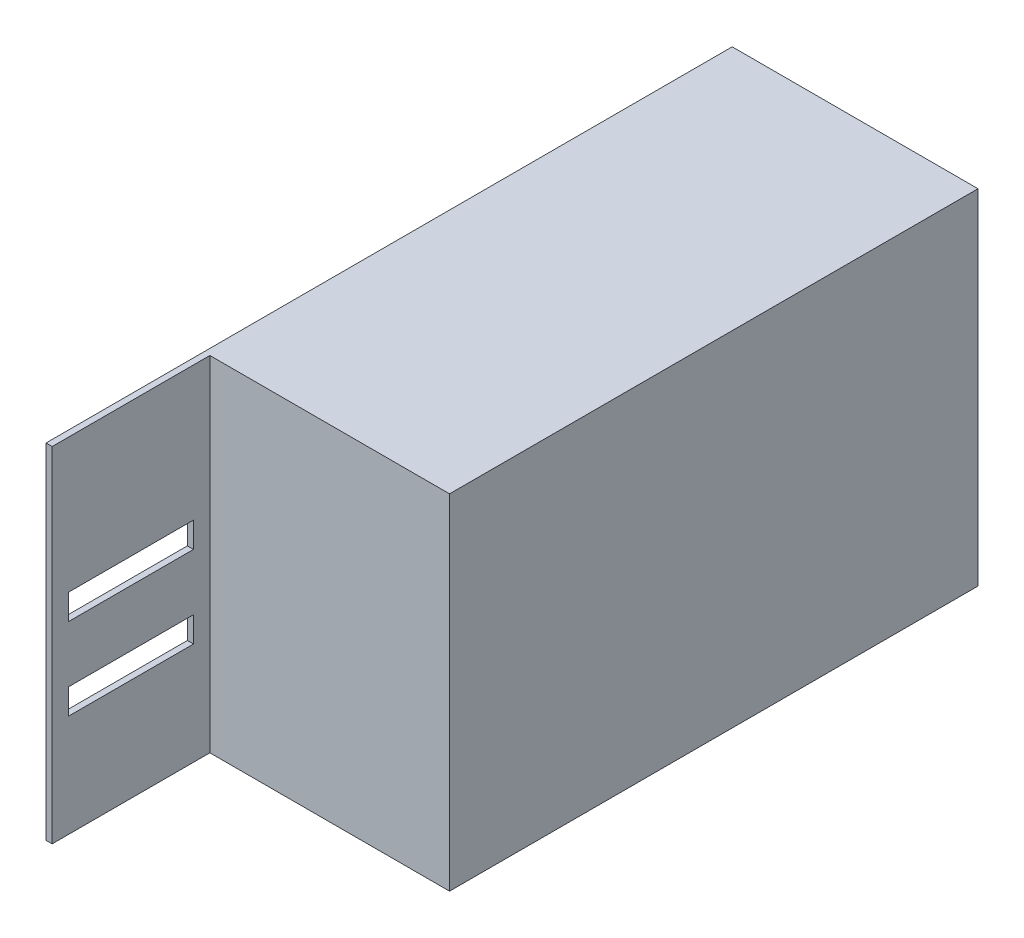
ISO-10303-21;
HEADER;
FILE_DESCRIPTION(('STEP AP214'),'2;1');
FILE_NAME('part.step','',(''),(''),'','','');
FILE_SCHEMA(('AUTOMOTIVE_DESIGN { 1 0 10303 214 1 1 1 1 }'));
ENDSEC;
DATA;
#1=APPLICATION_CONTEXT('core data for automotive mechanical design processes');
#2=APPLICATION_PROTOCOL_DEFINITION('international standard','automotive_design',2000,#1);
#3=PRODUCT_CONTEXT('',#1,'mechanical');
#4=PRODUCT('Part','Part','',(#3));
#5=PRODUCT_RELATED_PRODUCT_CATEGORY('part','',(#4));
#6=PRODUCT_DEFINITION_FORMATION('','',#4);
#7=PRODUCT_DEFINITION_CONTEXT('part definition',#1,'design');
#8=PRODUCT_DEFINITION('design','',#6,#7);
#9=PRODUCT_DEFINITION_SHAPE('','',#8);
#10=(LENGTH_UNIT() NAMED_UNIT(*) SI_UNIT(.MILLI.,.METRE.));
#11=(NAMED_UNIT(*) PLANE_ANGLE_UNIT() SI_UNIT($,.RADIAN.));
#12=(NAMED_UNIT(*) SI_UNIT($,.STERADIAN.) SOLID_ANGLE_UNIT());
#13=UNCERTAINTY_MEASURE_WITH_UNIT(LENGTH_MEASURE(1.E-05),#10,'distance_accuracy_value','');
#14=(GEOMETRIC_REPRESENTATION_CONTEXT(3) GLOBAL_UNCERTAINTY_ASSIGNED_CONTEXT((#13)) GLOBAL_UNIT_ASSIGNED_CONTEXT((#10,
#11,#12)) REPRESENTATION_CONTEXT('',''));
#15=CARTESIAN_POINT('',(0.,0.,0.));
#16=DIRECTION('',(0.,0.,1.));
#17=DIRECTION('',(1.,0.,0.));
#18=AXIS2_PLACEMENT_3D('',#15,#16,#17);
#19=CARTESIAN_POINT('',(60.,0.,0.));
#20=DIRECTION('',(0.,0.,-1.));
#21=DIRECTION('',(-1.,0.,0.));
#22=AXIS2_PLACEMENT_3D('',#19,#20,#21);
#23=PLANE('',#22);
#24=DIRECTION('',(0.,1.,0.));
#25=VECTOR('',#24,1.);
#26=CARTESIAN_POINT('',(1.5,0.,0.));
#27=LINE('',#26,#25);
#28=CARTESIAN_POINT('',(1.5,0.,0.));
#29=VERTEX_POINT('',#28);
#30=CARTESIAN_POINT('',(1.5,84.,0.));
#31=VERTEX_POINT('',#30);
#32=EDGE_CURVE('E285',#29,#31,#27,.T.);
#33=ORIENTED_EDGE('',*,*,#32,.F.);
#34=DIRECTION('',(-1.,0.,0.));
#35=VECTOR('',#34,1.);
#36=CARTESIAN_POINT('',(60.,0.,0.));
#37=LINE('',#36,#35);
#38=CARTESIAN_POINT('',(60.,0.,0.));
#39=VERTEX_POINT('',#38);
#40=EDGE_CURVE('E345',#39,#29,#37,.T.);
#41=ORIENTED_EDGE('',*,*,#40,.F.);
#42=DIRECTION('',(0.,-1.,0.));
#43=VECTOR('',#42,1.);
#44=CARTESIAN_POINT('',(60.,0.,0.));
#45=LINE('',#44,#43);
#46=CARTESIAN_POINT('',(60.,84.,0.));
#47=VERTEX_POINT('',#46);
#48=EDGE_CURVE('E342',#47,#39,#45,.T.);
#49=ORIENTED_EDGE('',*,*,#48,.F.);
#50=DIRECTION('',(-1.,0.,0.));
#51=VECTOR('',#50,1.);
#52=CARTESIAN_POINT('',(60.,84.,0.));
#53=LINE('',#52,#51);
#54=EDGE_CURVE('E358',#47,#31,#53,.T.);
#55=ORIENTED_EDGE('',*,*,#54,.T.);
#56=EDGE_LOOP('',(#33,#41,#49,#55));
#57=FACE_BOUND('',#56,.T.);
#58=ADVANCED_FACE('F45',(#57),#23,.F.);
#59=CARTESIAN_POINT('',(60.,0.,-129.));
#60=DIRECTION('',(0.,0.,1.));
#61=DIRECTION('',(1.,0.,0.));
#62=AXIS2_PLACEMENT_3D('',#59,#60,#61);
#63=PLANE('',#62);
#64=DIRECTION('',(1.,0.,0.));
#65=VECTOR('',#64,1.);
#66=CARTESIAN_POINT('',(1.5,1.5,-129.));
#67=LINE('',#66,#65);
#68=CARTESIAN_POINT('',(0.,1.5,-129.));
#69=VERTEX_POINT('',#68);
#70=CARTESIAN_POINT('',(58.5,1.5,-129.));
#71=VERTEX_POINT('',#70);
#72=EDGE_CURVE('E300',#69,#71,#67,.T.);
#73=ORIENTED_EDGE('',*,*,#72,.T.);
#74=DIRECTION('',(0.,1.,0.));
#75=VECTOR('',#74,1.);
#76=CARTESIAN_POINT('',(58.5,1.5,-129.));
#77=LINE('',#76,#75);
#78=CARTESIAN_POINT('',(58.5,82.5,-129.));
#79=VERTEX_POINT('',#78);
#80=EDGE_CURVE('E296',#71,#79,#77,.T.);
#81=ORIENTED_EDGE('',*,*,#80,.T.);
#82=DIRECTION('',(1.,0.,0.));
#83=VECTOR('',#82,1.);
#84=CARTESIAN_POINT('',(1.5,82.5,-129.));
#85=LINE('',#84,#83);
#86=CARTESIAN_POINT('',(0.,82.5,-129.));
#87=VERTEX_POINT('',#86);
#88=EDGE_CURVE('E292',#87,#79,#85,.T.);
#89=ORIENTED_EDGE('',*,*,#88,.F.);
#90=DIRECTION('',(0.,1.,0.));
#91=VECTOR('',#90,1.);
#92=CARTESIAN_POINT('',(0.,0.,-129.));
#93=LINE('',#92,#91);
#94=CARTESIAN_POINT('',(0.,84.,-129.));
#95=VERTEX_POINT('',#94);
#96=EDGE_CURVE('E348',#87,#95,#93,.T.);
#97=ORIENTED_EDGE('',*,*,#96,.T.);
#98=DIRECTION('',(-1.,0.,0.));
#99=VECTOR('',#98,1.);
#100=CARTESIAN_POINT('',(60.,84.,-129.));
#101=LINE('',#100,#99);
#102=CARTESIAN_POINT('',(60.,84.,-129.));
#103=VERTEX_POINT('',#102);
#104=EDGE_CURVE('E54',#103,#95,#101,.T.);
#105=ORIENTED_EDGE('',*,*,#104,.F.);
#106=DIRECTION('',(0.,1.,0.));
#107=VECTOR('',#106,1.);
#108=CARTESIAN_POINT('',(60.,0.,-129.));
#109=LINE('',#108,#107);
#110=CARTESIAN_POINT('',(60.,0.,-129.));
#111=VERTEX_POINT('',#110);
#112=EDGE_CURVE('E335',#111,#103,#109,.T.);
#113=ORIENTED_EDGE('',*,*,#112,.F.);
#114=DIRECTION('',(-1.,0.,0.));
#115=VECTOR('',#114,1.);
#116=CARTESIAN_POINT('',(60.,0.,-129.));
#117=LINE('',#116,#115);
#118=CARTESIAN_POINT('',(0.,0.,-129.));
#119=VERTEX_POINT('',#118);
#120=EDGE_CURVE('E11',#111,#119,#117,.T.);
#121=ORIENTED_EDGE('',*,*,#120,.T.);
#122=EDGE_CURVE('E349',#119,#69,#93,.T.);
#123=ORIENTED_EDGE('',*,*,#122,.T.);
#124=EDGE_LOOP('',(#73,#81,#89,#97,#105,#113,#121,#123));
#125=FACE_BOUND('',#124,.T.);
#126=ADVANCED_FACE('F389',(#125),#63,.F.);
#127=CARTESIAN_POINT('',(0.,0.,0.));
#128=DIRECTION('',(1.,0.,0.));
#129=DIRECTION('',(0.,0.,-1.));
#130=AXIS2_PLACEMENT_3D('',#127,#128,#129);
#131=PLANE('',#130);
#132=DIRECTION('',(0.,0.,1.));
#133=VECTOR('',#132,1.);
#134=CARTESIAN_POINT('',(0.,31.2,34.5));
#135=LINE('',#134,#133);
#136=CARTESIAN_POINT('',(0.,31.2,4.));
#137=VERTEX_POINT('',#136);
#138=CARTESIAN_POINT('',(0.,31.2,34.5));
#139=VERTEX_POINT('',#138);
#140=EDGE_CURVE('E184',#137,#139,#135,.T.);
#141=ORIENTED_EDGE('',*,*,#140,.T.);
#142=DIRECTION('',(0.,-1.,0.));
#143=VECTOR('',#142,1.);
#144=CARTESIAN_POINT('',(0.,25.,34.5));
#145=LINE('',#144,#143);
#146=CARTESIAN_POINT('',(0.,25.,34.5));
#147=VERTEX_POINT('',#146);
#148=EDGE_CURVE('E175',#139,#147,#145,.T.);
#149=ORIENTED_EDGE('',*,*,#148,.T.);
#150=DIRECTION('',(0.,0.,-1.));
#151=VECTOR('',#150,1.);
#152=CARTESIAN_POINT('',(0.,25.,34.5));
#153=LINE('',#152,#151);
#154=CARTESIAN_POINT('',(0.,25.,4.));
#155=VERTEX_POINT('',#154);
#156=EDGE_CURVE('E187',#147,#155,#153,.T.);
#157=ORIENTED_EDGE('',*,*,#156,.T.);
#158=DIRECTION('',(0.,1.,0.));
#159=VECTOR('',#158,1.);
#160=CARTESIAN_POINT('',(0.,25.,4.));
#161=LINE('',#160,#159);
#162=EDGE_CURVE('E61',#155,#137,#161,.T.);
#163=ORIENTED_EDGE('',*,*,#162,.T.);
#164=EDGE_LOOP('',(#141,#149,#157,#163));
#165=FACE_BOUND('',#164,.T.);
#166=DIRECTION('',(0.,0.,1.));
#167=VECTOR('',#166,1.);
#168=CARTESIAN_POINT('',(0.,51.2,34.5));
#169=LINE('',#168,#167);
#170=CARTESIAN_POINT('',(0.,51.2,4.));
#171=VERTEX_POINT('',#170);
#172=CARTESIAN_POINT('',(0.,51.2,34.5));
#173=VERTEX_POINT('',#172);
#174=EDGE_CURVE('E229',#171,#173,#169,.T.);
#175=ORIENTED_EDGE('',*,*,#174,.T.);
#176=DIRECTION('',(0.,-1.,0.));
#177=VECTOR('',#176,1.);
#178=CARTESIAN_POINT('',(0.,45.,34.5));
#179=LINE('',#178,#177);
#180=CARTESIAN_POINT('',(0.,45.,34.5));
#181=VERTEX_POINT('',#180);
#182=EDGE_CURVE('E244',#173,#181,#179,.T.);
#183=ORIENTED_EDGE('',*,*,#182,.T.);
#184=DIRECTION('',(0.,0.,-1.));
#185=VECTOR('',#184,1.);
#186=CARTESIAN_POINT('',(0.,45.,34.5));
#187=LINE('',#186,#185);
#188=CARTESIAN_POINT('',(0.,45.,4.));
#189=VERTEX_POINT('',#188);
#190=EDGE_CURVE('E259',#181,#189,#187,.T.);
#191=ORIENTED_EDGE('',*,*,#190,.T.);
#192=DIRECTION('',(0.,1.,0.));
#193=VECTOR('',#192,1.);
#194=CARTESIAN_POINT('',(0.,45.,4.));
#195=LINE('',#194,#193);
#196=EDGE_CURVE('E69',#189,#171,#195,.T.);
#197=ORIENTED_EDGE('',*,*,#196,.T.);
#198=EDGE_LOOP('',(#175,#183,#191,#197));
#199=FACE_BOUND('',#198,.T.);
#200=DIRECTION('',(0.,0.,1.));
#201=VECTOR('',#200,1.);
#202=CARTESIAN_POINT('',(0.,82.5,0.));
#203=LINE('',#202,#201);
#204=CARTESIAN_POINT('',(0.,82.5,-1.5));
#205=VERTEX_POINT('',#204);
#206=EDGE_CURVE('E324',#87,#205,#203,.T.);
#207=ORIENTED_EDGE('',*,*,#206,.T.);
#208=DIRECTION('',(0.,-1.,0.));
#209=VECTOR('',#208,1.);
#210=CARTESIAN_POINT('',(0.,0.,-1.5));
#211=LINE('',#210,#209);
#212=CARTESIAN_POINT('',(0.,1.5,-1.5));
#213=VERTEX_POINT('',#212);
#214=EDGE_CURVE('E309',#205,#213,#211,.T.);
#215=ORIENTED_EDGE('',*,*,#214,.T.);
#216=DIRECTION('',(0.,0.,-1.));
#217=VECTOR('',#216,1.);
#218=CARTESIAN_POINT('',(0.,1.5,0.));
#219=LINE('',#218,#217);
#220=EDGE_CURVE('E304',#213,#69,#219,.T.);
#221=ORIENTED_EDGE('',*,*,#220,.T.);
#222=ORIENTED_EDGE('',*,*,#122,.F.);
#223=DIRECTION('',(0.,0.,-1.));
#224=VECTOR('',#223,1.);
#225=CARTESIAN_POINT('',(0.,0.,0.));
#226=LINE('',#225,#224);
#227=CARTESIAN_POINT('',(0.,0.,38.5));
#228=VERTEX_POINT('',#227);
#229=EDGE_CURVE('E317',#228,#119,#226,.T.);
#230=ORIENTED_EDGE('',*,*,#229,.F.);
#231=DIRECTION('',(0.,1.,0.));
#232=VECTOR('',#231,1.);
#233=CARTESIAN_POINT('',(0.,84.,38.5));
#234=LINE('',#233,#232);
#235=CARTESIAN_POINT('',(0.,84.,38.5));
#236=VERTEX_POINT('',#235);
#237=EDGE_CURVE('E219',#228,#236,#234,.T.);
#238=ORIENTED_EDGE('',*,*,#237,.T.);
#239=DIRECTION('',(0.,0.,1.));
#240=VECTOR('',#239,1.);
#241=CARTESIAN_POINT('',(0.,84.,0.));
#242=LINE('',#241,#240);
#243=EDGE_CURVE('E336',#95,#236,#242,.T.);
#244=ORIENTED_EDGE('',*,*,#243,.F.);
#245=ORIENTED_EDGE('',*,*,#96,.F.);
#246=EDGE_LOOP('',(#207,#215,#221,#222,#230,#238,#244,#245));
#247=FACE_BOUND('',#246,.T.);
#248=ADVANCED_FACE('F192',(#165,#199,#247),#131,.F.);
#249=CARTESIAN_POINT('',(60.,0.,0.));
#250=DIRECTION('',(0.,1.,0.));
#251=DIRECTION('',(0.,0.,1.));
#252=AXIS2_PLACEMENT_3D('',#249,#250,#251);
#253=PLANE('',#252);
#254=ORIENTED_EDGE('',*,*,#229,.T.);
#255=ORIENTED_EDGE('',*,*,#120,.F.);
#256=DIRECTION('',(0.,0.,-1.));
#257=VECTOR('',#256,1.);
#258=CARTESIAN_POINT('',(60.,0.,0.));
#259=LINE('',#258,#257);
#260=EDGE_CURVE('E331',#39,#111,#259,.T.);
#261=ORIENTED_EDGE('',*,*,#260,.F.);
#262=ORIENTED_EDGE('',*,*,#40,.T.);
#263=DIRECTION('',(0.,0.,1.));
#264=VECTOR('',#263,1.);
#265=CARTESIAN_POINT('',(1.5,0.,-1.49999999999999));
#266=LINE('',#265,#264);
#267=CARTESIAN_POINT('',(1.5,0.,38.5));
#268=VERTEX_POINT('',#267);
#269=EDGE_CURVE('E266',#29,#268,#266,.T.);
#270=ORIENTED_EDGE('',*,*,#269,.T.);
#271=DIRECTION('',(-1.,0.,0.));
#272=VECTOR('',#271,1.);
#273=CARTESIAN_POINT('',(1.5,0.,38.5));
#274=LINE('',#273,#272);
#275=EDGE_CURVE('E277',#268,#228,#274,.T.);
#276=ORIENTED_EDGE('',*,*,#275,.T.);
#277=EDGE_LOOP('',(#254,#255,#261,#262,#270,#276));
#278=FACE_BOUND('',#277,.T.);
#279=ADVANCED_FACE('F47',(#278),#253,.F.);
#280=CARTESIAN_POINT('',(60.,84.,0.));
#281=DIRECTION('',(0.,-1.,0.));
#282=DIRECTION('',(0.,0.,-1.));
#283=AXIS2_PLACEMENT_3D('',#280,#281,#282);
#284=PLANE('',#283);
#285=ORIENTED_EDGE('',*,*,#243,.T.);
#286=DIRECTION('',(-1.,0.,0.));
#287=VECTOR('',#286,1.);
#288=CARTESIAN_POINT('',(1.5,84.,38.5));
#289=LINE('',#288,#287);
#290=CARTESIAN_POINT('',(1.5,84.,38.5));
#291=VERTEX_POINT('',#290);
#292=EDGE_CURVE('E281',#291,#236,#289,.T.);
#293=ORIENTED_EDGE('',*,*,#292,.F.);
#294=DIRECTION('',(0.,0.,-1.));
#295=VECTOR('',#294,1.);
#296=CARTESIAN_POINT('',(1.5,84.,-1.5));
#297=LINE('',#296,#295);
#298=EDGE_CURVE('E273',#291,#31,#297,.T.);
#299=ORIENTED_EDGE('',*,*,#298,.T.);
#300=ORIENTED_EDGE('',*,*,#54,.F.);
#301=DIRECTION('',(0.,0.,1.));
#302=VECTOR('',#301,1.);
#303=CARTESIAN_POINT('',(60.,84.,0.));
#304=LINE('',#303,#302);
#305=EDGE_CURVE('E339',#103,#47,#304,.T.);
#306=ORIENTED_EDGE('',*,*,#305,.F.);
#307=ORIENTED_EDGE('',*,*,#104,.T.);
#308=EDGE_LOOP('',(#285,#293,#299,#300,#306,#307));
#309=FACE_BOUND('',#308,.T.);
#310=ADVANCED_FACE('F366',(#309),#284,.F.);
#311=CARTESIAN_POINT('',(60.,0.,0.));
#312=DIRECTION('',(1.,0.,0.));
#313=DIRECTION('',(0.,0.,-1.));
#314=AXIS2_PLACEMENT_3D('',#311,#312,#313);
#315=PLANE('',#314);
#316=ORIENTED_EDGE('',*,*,#260,.T.);
#317=ORIENTED_EDGE('',*,*,#112,.T.);
#318=ORIENTED_EDGE('',*,*,#305,.T.);
#319=ORIENTED_EDGE('',*,*,#48,.T.);
#320=EDGE_LOOP('',(#316,#317,#318,#319));
#321=FACE_BOUND('',#320,.T.);
#322=ADVANCED_FACE('F388',(#321),#315,.T.);
#323=CARTESIAN_POINT('',(60.,1.5,0.));
#324=DIRECTION('',(0.,1.,0.));
#325=DIRECTION('',(0.,0.,1.));
#326=AXIS2_PLACEMENT_3D('',#323,#324,#325);
#327=PLANE('',#326);
#328=ORIENTED_EDGE('',*,*,#220,.F.);
#329=DIRECTION('',(-1.,0.,0.));
#330=VECTOR('',#329,1.);
#331=CARTESIAN_POINT('',(60.,1.5,-1.5));
#332=LINE('',#331,#330);
#333=CARTESIAN_POINT('',(58.5,1.5,-1.5));
#334=VERTEX_POINT('',#333);
#335=EDGE_CURVE('E310',#334,#213,#332,.T.);
#336=ORIENTED_EDGE('',*,*,#335,.F.);
#337=DIRECTION('',(0.,0.,-1.));
#338=VECTOR('',#337,1.);
#339=CARTESIAN_POINT('',(58.5,1.5,0.));
#340=LINE('',#339,#338);
#341=EDGE_CURVE('E305',#334,#71,#340,.T.);
#342=ORIENTED_EDGE('',*,*,#341,.T.);
#343=ORIENTED_EDGE('',*,*,#72,.F.);
#344=EDGE_LOOP('',(#328,#336,#342,#343));
#345=FACE_BOUND('',#344,.T.);
#346=ADVANCED_FACE('F395',(#345),#327,.T.);
#347=CARTESIAN_POINT('',(60.,82.5,0.));
#348=DIRECTION('',(0.,-1.,0.));
#349=DIRECTION('',(0.,0.,-1.));
#350=AXIS2_PLACEMENT_3D('',#347,#348,#349);
#351=PLANE('',#350);
#352=ORIENTED_EDGE('',*,*,#206,.F.);
#353=ORIENTED_EDGE('',*,*,#88,.T.);
#354=DIRECTION('',(0.,0.,1.));
#355=VECTOR('',#354,1.);
#356=CARTESIAN_POINT('',(58.5,82.5,0.));
#357=LINE('',#356,#355);
#358=CARTESIAN_POINT('',(58.5,82.5,-1.5));
#359=VERTEX_POINT('',#358);
#360=EDGE_CURVE('E308',#79,#359,#357,.T.);
#361=ORIENTED_EDGE('',*,*,#360,.T.);
#362=DIRECTION('',(-1.,0.,0.));
#363=VECTOR('',#362,1.);
#364=CARTESIAN_POINT('',(60.,82.5,-1.5));
#365=LINE('',#364,#363);
#366=EDGE_CURVE('E313',#359,#205,#365,.T.);
#367=ORIENTED_EDGE('',*,*,#366,.T.);
#368=EDGE_LOOP('',(#352,#353,#361,#367));
#369=FACE_BOUND('',#368,.T.);
#370=ADVANCED_FACE('F403',(#369),#351,.T.);
#371=CARTESIAN_POINT('',(60.,0.,-1.5));
#372=DIRECTION('',(0.,0.,-1.));
#373=DIRECTION('',(-1.,0.,0.));
#374=AXIS2_PLACEMENT_3D('',#371,#372,#373);
#375=PLANE('',#374);
#376=ORIENTED_EDGE('',*,*,#214,.F.);
#377=ORIENTED_EDGE('',*,*,#366,.F.);
#378=DIRECTION('',(0.,-1.,0.));
#379=VECTOR('',#378,1.);
#380=CARTESIAN_POINT('',(58.5,0.,-1.5));
#381=LINE('',#380,#379);
#382=EDGE_CURVE('E314',#359,#334,#381,.T.);
#383=ORIENTED_EDGE('',*,*,#382,.T.);
#384=ORIENTED_EDGE('',*,*,#335,.T.);
#385=EDGE_LOOP('',(#376,#377,#383,#384));
#386=FACE_BOUND('',#385,.T.);
#387=ADVANCED_FACE('F406',(#386),#375,.T.);
#388=CARTESIAN_POINT('',(58.5,0.,0.));
#389=DIRECTION('',(1.,0.,0.));
#390=DIRECTION('',(0.,0.,-1.));
#391=AXIS2_PLACEMENT_3D('',#388,#389,#390);
#392=PLANE('',#391);
#393=ORIENTED_EDGE('',*,*,#341,.F.);
#394=ORIENTED_EDGE('',*,*,#382,.F.);
#395=ORIENTED_EDGE('',*,*,#360,.F.);
#396=ORIENTED_EDGE('',*,*,#80,.F.);
#397=EDGE_LOOP('',(#393,#394,#395,#396));
#398=FACE_BOUND('',#397,.T.);
#399=ADVANCED_FACE('F400',(#398),#392,.F.);
#400=CARTESIAN_POINT('',(1.5,0.,0.));
#401=DIRECTION('',(-1.,0.,0.));
#402=DIRECTION('',(0.,0.,1.));
#403=AXIS2_PLACEMENT_3D('',#400,#401,#402);
#404=PLANE('',#403);
#405=DIRECTION('',(0.,0.,-1.));
#406=VECTOR('',#405,1.);
#407=CARTESIAN_POINT('',(1.5,25.,34.5));
#408=LINE('',#407,#406);
#409=CARTESIAN_POINT('',(1.5,25.,34.5));
#410=VERTEX_POINT('',#409);
#411=CARTESIAN_POINT('',(1.5,25.,4.));
#412=VERTEX_POINT('',#411);
#413=EDGE_CURVE('E209',#410,#412,#408,.T.);
#414=ORIENTED_EDGE('',*,*,#413,.F.);
#415=DIRECTION('',(0.,-1.,0.));
#416=VECTOR('',#415,1.);
#417=CARTESIAN_POINT('',(1.5,25.,34.5));
#418=LINE('',#417,#416);
#419=CARTESIAN_POINT('',(1.5,31.2,34.5));
#420=VERTEX_POINT('',#419);
#421=EDGE_CURVE('E178',#420,#410,#418,.T.);
#422=ORIENTED_EDGE('',*,*,#421,.F.);
#423=DIRECTION('',(0.,0.,1.));
#424=VECTOR('',#423,1.);
#425=CARTESIAN_POINT('',(1.5,31.2,34.5));
#426=LINE('',#425,#424);
#427=CARTESIAN_POINT('',(1.5,31.2,4.));
#428=VERTEX_POINT('',#427);
#429=EDGE_CURVE('E196',#428,#420,#426,.T.);
#430=ORIENTED_EDGE('',*,*,#429,.F.);
#431=DIRECTION('',(0.,1.,0.));
#432=VECTOR('',#431,1.);
#433=CARTESIAN_POINT('',(1.5,25.,4.));
#434=LINE('',#433,#432);
#435=EDGE_CURVE('E200',#412,#428,#434,.T.);
#436=ORIENTED_EDGE('',*,*,#435,.F.);
#437=EDGE_LOOP('',(#414,#422,#430,#436));
#438=FACE_BOUND('',#437,.T.);
#439=DIRECTION('',(0.,0.,-1.));
#440=VECTOR('',#439,1.);
#441=CARTESIAN_POINT('',(1.5,45.,34.5));
#442=LINE('',#441,#440);
#443=CARTESIAN_POINT('',(1.5,45.,34.5));
#444=VERTEX_POINT('',#443);
#445=CARTESIAN_POINT('',(1.5,45.,4.));
#446=VERTEX_POINT('',#445);
#447=EDGE_CURVE('E248',#444,#446,#442,.T.);
#448=ORIENTED_EDGE('',*,*,#447,.F.);
#449=DIRECTION('',(0.,-1.,0.));
#450=VECTOR('',#449,1.);
#451=CARTESIAN_POINT('',(1.5,45.,34.5));
#452=LINE('',#451,#450);
#453=CARTESIAN_POINT('',(1.5,51.2,34.5));
#454=VERTEX_POINT('',#453);
#455=EDGE_CURVE('E210',#454,#444,#452,.T.);
#456=ORIENTED_EDGE('',*,*,#455,.F.);
#457=DIRECTION('',(0.,0.,1.));
#458=VECTOR('',#457,1.);
#459=CARTESIAN_POINT('',(1.5,51.2,34.5));
#460=LINE('',#459,#458);
#461=CARTESIAN_POINT('',(1.5,51.2,4.));
#462=VERTEX_POINT('',#461);
#463=EDGE_CURVE('E239',#462,#454,#460,.T.);
#464=ORIENTED_EDGE('',*,*,#463,.F.);
#465=DIRECTION('',(0.,1.,0.));
#466=VECTOR('',#465,1.);
#467=CARTESIAN_POINT('',(1.5,45.,4.));
#468=LINE('',#467,#466);
#469=EDGE_CURVE('E243',#446,#462,#468,.T.);
#470=ORIENTED_EDGE('',*,*,#469,.F.);
#471=EDGE_LOOP('',(#448,#456,#464,#470));
#472=FACE_BOUND('',#471,.T.);
#473=ORIENTED_EDGE('',*,*,#269,.F.);
#474=ORIENTED_EDGE('',*,*,#32,.T.);
#475=ORIENTED_EDGE('',*,*,#298,.F.);
#476=DIRECTION('',(0.,1.,0.));
#477=VECTOR('',#476,1.);
#478=CARTESIAN_POINT('',(1.5,84.,38.5));
#479=LINE('',#478,#477);
#480=EDGE_CURVE('E269',#268,#291,#479,.T.);
#481=ORIENTED_EDGE('',*,*,#480,.F.);
#482=EDGE_LOOP('',(#473,#474,#475,#481));
#483=FACE_BOUND('',#482,.T.);
#484=ADVANCED_FACE('F381',(#438,#472,#483),#404,.F.);
#485=CARTESIAN_POINT('',(1.5,84.,38.5));
#486=DIRECTION('',(0.,0.,1.));
#487=DIRECTION('',(0.,-1.,0.));
#488=AXIS2_PLACEMENT_3D('',#485,#486,#487);
#489=PLANE('',#488);
#490=ORIENTED_EDGE('',*,*,#237,.F.);
#491=ORIENTED_EDGE('',*,*,#275,.F.);
#492=ORIENTED_EDGE('',*,*,#480,.T.);
#493=ORIENTED_EDGE('',*,*,#292,.T.);
#494=EDGE_LOOP('',(#490,#491,#492,#493));
#495=FACE_BOUND('',#494,.T.);
#496=ADVANCED_FACE('F375',(#495),#489,.T.);
#497=CARTESIAN_POINT('',(0.,45.,34.5));
#498=DIRECTION('',(0.,0.,1.));
#499=DIRECTION('',(1.,0.,0.));
#500=AXIS2_PLACEMENT_3D('',#497,#498,#499);
#501=PLANE('',#500);
#502=ORIENTED_EDGE('',*,*,#455,.T.);
#503=DIRECTION('',(1.,0.,0.));
#504=VECTOR('',#503,1.);
#505=CARTESIAN_POINT('',(0.,45.,34.5));
#506=LINE('',#505,#504);
#507=EDGE_CURVE('E225',#181,#444,#506,.T.);
#508=ORIENTED_EDGE('',*,*,#507,.F.);
#509=ORIENTED_EDGE('',*,*,#182,.F.);
#510=DIRECTION('',(1.,0.,0.));
#511=VECTOR('',#510,1.);
#512=CARTESIAN_POINT('',(0.,51.2,34.5));
#513=LINE('',#512,#511);
#514=EDGE_CURVE('E236',#173,#454,#513,.T.);
#515=ORIENTED_EDGE('',*,*,#514,.T.);
#516=EDGE_LOOP('',(#502,#508,#509,#515));
#517=FACE_BOUND('',#516,.T.);
#518=ADVANCED_FACE('F450',(#517),#501,.F.);
#519=CARTESIAN_POINT('',(0.,51.2,34.5));
#520=DIRECTION('',(0.,1.,0.));
#521=DIRECTION('',(0.,0.,1.));
#522=AXIS2_PLACEMENT_3D('',#519,#520,#521);
#523=PLANE('',#522);
#524=ORIENTED_EDGE('',*,*,#463,.T.);
#525=ORIENTED_EDGE('',*,*,#514,.F.);
#526=ORIENTED_EDGE('',*,*,#174,.F.);
#527=DIRECTION('',(1.,0.,0.));
#528=VECTOR('',#527,1.);
#529=CARTESIAN_POINT('',(0.,51.2,4.));
#530=LINE('',#529,#528);
#531=EDGE_CURVE('E233',#171,#462,#530,.T.);
#532=ORIENTED_EDGE('',*,*,#531,.T.);
#533=EDGE_LOOP('',(#524,#525,#526,#532));
#534=FACE_BOUND('',#533,.T.);
#535=ADVANCED_FACE('F454',(#534),#523,.F.);
#536=CARTESIAN_POINT('',(0.,45.,4.));
#537=DIRECTION('',(0.,0.,-1.));
#538=DIRECTION('',(-1.,0.,0.));
#539=AXIS2_PLACEMENT_3D('',#536,#537,#538);
#540=PLANE('',#539);
#541=ORIENTED_EDGE('',*,*,#469,.T.);
#542=ORIENTED_EDGE('',*,*,#531,.F.);
#543=ORIENTED_EDGE('',*,*,#196,.F.);
#544=DIRECTION('',(1.,0.,0.));
#545=VECTOR('',#544,1.);
#546=CARTESIAN_POINT('',(0.,45.,4.));
#547=LINE('',#546,#545);
#548=EDGE_CURVE('E230',#189,#446,#547,.T.);
#549=ORIENTED_EDGE('',*,*,#548,.T.);
#550=EDGE_LOOP('',(#541,#542,#543,#549));
#551=FACE_BOUND('',#550,.T.);
#552=ADVANCED_FACE('F463',(#551),#540,.F.);
#553=CARTESIAN_POINT('',(0.,45.,34.5));
#554=DIRECTION('',(0.,-1.,0.));
#555=DIRECTION('',(0.,0.,-1.));
#556=AXIS2_PLACEMENT_3D('',#553,#554,#555);
#557=PLANE('',#556);
#558=ORIENTED_EDGE('',*,*,#447,.T.);
#559=ORIENTED_EDGE('',*,*,#548,.F.);
#560=ORIENTED_EDGE('',*,*,#190,.F.);
#561=ORIENTED_EDGE('',*,*,#507,.T.);
#562=EDGE_LOOP('',(#558,#559,#560,#561));
#563=FACE_BOUND('',#562,.T.);
#564=ADVANCED_FACE('F472',(#563),#557,.F.);
#565=CARTESIAN_POINT('',(0.,25.,34.5));
#566=DIRECTION('',(0.,0.,1.));
#567=DIRECTION('',(1.,0.,0.));
#568=AXIS2_PLACEMENT_3D('',#565,#566,#567);
#569=PLANE('',#568);
#570=ORIENTED_EDGE('',*,*,#421,.T.);
#571=DIRECTION('',(1.,0.,0.));
#572=VECTOR('',#571,1.);
#573=CARTESIAN_POINT('',(0.,25.,34.5));
#574=LINE('',#573,#572);
#575=EDGE_CURVE('E171',#147,#410,#574,.T.);
#576=ORIENTED_EDGE('',*,*,#575,.F.);
#577=ORIENTED_EDGE('',*,*,#148,.F.);
#578=DIRECTION('',(1.,0.,0.));
#579=VECTOR('',#578,1.);
#580=CARTESIAN_POINT('',(0.,31.2,34.5));
#581=LINE('',#580,#579);
#582=EDGE_CURVE('E216',#139,#420,#581,.T.);
#583=ORIENTED_EDGE('',*,*,#582,.T.);
#584=EDGE_LOOP('',(#570,#576,#577,#583));
#585=FACE_BOUND('',#584,.T.);
#586=ADVANCED_FACE('F173',(#585),#569,.F.);
#587=CARTESIAN_POINT('',(0.,31.2,34.5));
#588=DIRECTION('',(0.,1.,0.));
#589=DIRECTION('',(0.,0.,1.));
#590=AXIS2_PLACEMENT_3D('',#587,#588,#589);
#591=PLANE('',#590);
#592=ORIENTED_EDGE('',*,*,#429,.T.);
#593=ORIENTED_EDGE('',*,*,#582,.F.);
#594=ORIENTED_EDGE('',*,*,#140,.F.);
#595=DIRECTION('',(1.,0.,0.));
#596=VECTOR('',#595,1.);
#597=CARTESIAN_POINT('',(0.,31.2,4.));
#598=LINE('',#597,#596);
#599=EDGE_CURVE('E220',#137,#428,#598,.T.);
#600=ORIENTED_EDGE('',*,*,#599,.T.);
#601=EDGE_LOOP('',(#592,#593,#594,#600));
#602=FACE_BOUND('',#601,.T.);
#603=ADVANCED_FACE('F488',(#602),#591,.F.);
#604=CARTESIAN_POINT('',(0.,25.,4.));
#605=DIRECTION('',(0.,0.,-1.));
#606=DIRECTION('',(-1.,0.,0.));
#607=AXIS2_PLACEMENT_3D('',#604,#605,#606);
#608=PLANE('',#607);
#609=ORIENTED_EDGE('',*,*,#435,.T.);
#610=ORIENTED_EDGE('',*,*,#599,.F.);
#611=ORIENTED_EDGE('',*,*,#162,.F.);
#612=DIRECTION('',(1.,0.,0.));
#613=VECTOR('',#612,1.);
#614=CARTESIAN_POINT('',(0.,25.,4.));
#615=LINE('',#614,#613);
#616=EDGE_CURVE('E183',#155,#412,#615,.T.);
#617=ORIENTED_EDGE('',*,*,#616,.T.);
#618=EDGE_LOOP('',(#609,#610,#611,#617));
#619=FACE_BOUND('',#618,.T.);
#620=ADVANCED_FACE('F496',(#619),#608,.F.);
#621=CARTESIAN_POINT('',(0.,25.,34.5));
#622=DIRECTION('',(0.,-1.,0.));
#623=DIRECTION('',(0.,0.,-1.));
#624=AXIS2_PLACEMENT_3D('',#621,#622,#623);
#625=PLANE('',#624);
#626=ORIENTED_EDGE('',*,*,#413,.T.);
#627=ORIENTED_EDGE('',*,*,#616,.F.);
#628=ORIENTED_EDGE('',*,*,#156,.F.);
#629=ORIENTED_EDGE('',*,*,#575,.T.);
#630=EDGE_LOOP('',(#626,#627,#628,#629));
#631=FACE_BOUND('',#630,.T.);
#632=ADVANCED_FACE('F188',(#631),#625,.F.);
#633=CLOSED_SHELL('',(#58,#126,#248,#279,#310,#322,#346,#370,#387,#399,#484,#496,#518,#535,#552,
#564,#586,#603,#620,#632));
#634=MANIFOLD_SOLID_BREP('B2',#633);
#635=ADVANCED_BREP_SHAPE_REPRESENTATION('',(#18,#634),#14);
#636=SHAPE_DEFINITION_REPRESENTATION(#9,#635);
ENDSEC;
END-ISO-10303-21;
